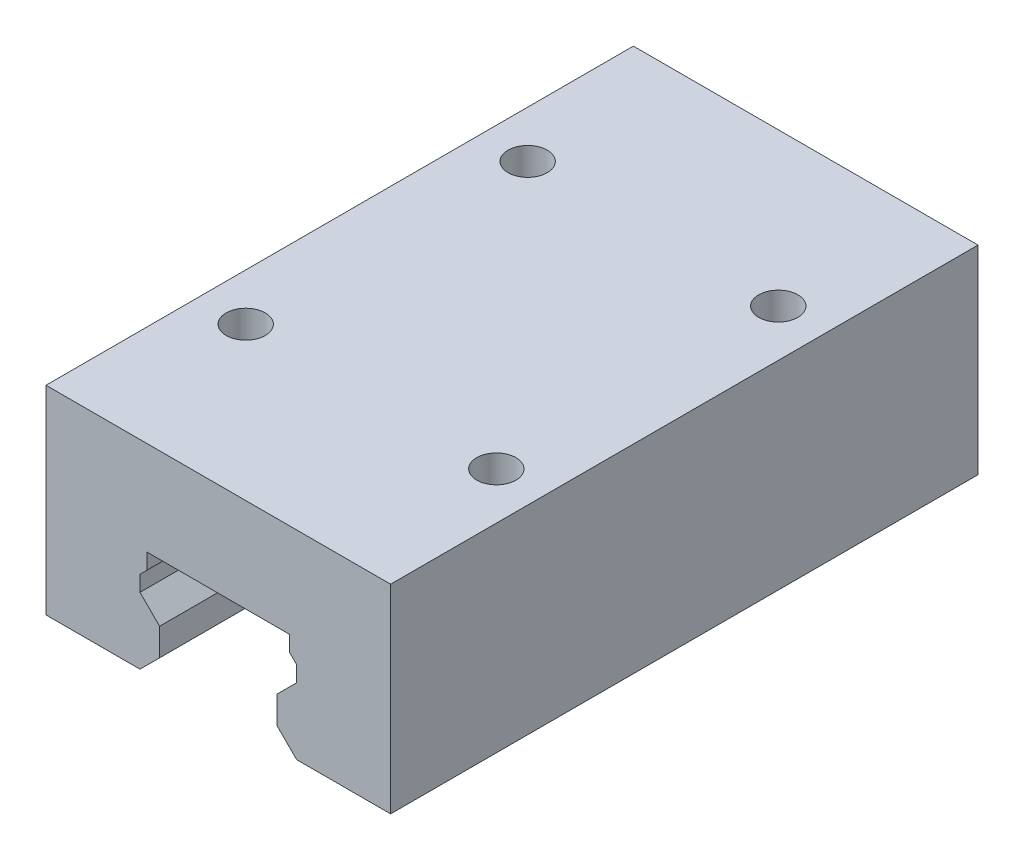
ISO-10303-21;
HEADER;
FILE_DESCRIPTION(('STEP AP214'),'2;1');
FILE_NAME('part.step','',(''),(''),'','','');
FILE_SCHEMA(('AUTOMOTIVE_DESIGN { 1 0 10303 214 1 1 1 1 }'));
ENDSEC;
DATA;
#1=APPLICATION_CONTEXT('core data for automotive mechanical design processes');
#2=APPLICATION_PROTOCOL_DEFINITION('international standard','automotive_design',2000,#1);
#3=PRODUCT_CONTEXT('',#1,'mechanical');
#4=PRODUCT('Part','Part','',(#3));
#5=PRODUCT_RELATED_PRODUCT_CATEGORY('part','',(#4));
#6=PRODUCT_DEFINITION_FORMATION('','',#4);
#7=PRODUCT_DEFINITION_CONTEXT('part definition',#1,'design');
#8=PRODUCT_DEFINITION('design','',#6,#7);
#9=PRODUCT_DEFINITION_SHAPE('','',#8);
#10=(LENGTH_UNIT() NAMED_UNIT(*) SI_UNIT(.MILLI.,.METRE.));
#11=(NAMED_UNIT(*) PLANE_ANGLE_UNIT() SI_UNIT($,.RADIAN.));
#12=(NAMED_UNIT(*) SI_UNIT($,.STERADIAN.) SOLID_ANGLE_UNIT());
#13=UNCERTAINTY_MEASURE_WITH_UNIT(LENGTH_MEASURE(1.E-05),#10,'distance_accuracy_value','');
#14=(GEOMETRIC_REPRESENTATION_CONTEXT(3) GLOBAL_UNCERTAINTY_ASSIGNED_CONTEXT((#13)) GLOBAL_UNIT_ASSIGNED_CONTEXT((#10,
#11,#12)) REPRESENTATION_CONTEXT('',''));
#15=CARTESIAN_POINT('',(0.,0.,0.));
#16=DIRECTION('',(0.,0.,1.));
#17=DIRECTION('',(1.,0.,0.));
#18=AXIS2_PLACEMENT_3D('',#15,#16,#17);
#19=CARTESIAN_POINT('',(22.,0.,-75.));
#20=DIRECTION('',(1.,0.,0.));
#21=DIRECTION('',(0.,1.,0.));
#22=AXIS2_PLACEMENT_3D('',#19,#20,#21);
#23=PLANE('',#22);
#24=DIRECTION('',(0.,1.,0.));
#25=VECTOR('',#24,1.);
#26=CARTESIAN_POINT('',(22.,0.,0.));
#27=LINE('',#26,#25);
#28=CARTESIAN_POINT('',(22.,-25.4,0.));
#29=VERTEX_POINT('',#28);
#30=CARTESIAN_POINT('',(22.,0.,0.));
#31=VERTEX_POINT('',#30);
#32=EDGE_CURVE('E208',#29,#31,#27,.T.);
#33=ORIENTED_EDGE('',*,*,#32,.F.);
#34=DIRECTION('',(0.,0.,1.));
#35=VECTOR('',#34,1.);
#36=CARTESIAN_POINT('',(22.,-25.4,-75.));
#37=LINE('',#36,#35);
#38=CARTESIAN_POINT('',(22.,-25.4,-75.));
#39=VERTEX_POINT('',#38);
#40=EDGE_CURVE('E11',#39,#29,#37,.T.);
#41=ORIENTED_EDGE('',*,*,#40,.F.);
#42=DIRECTION('',(0.,1.,0.));
#43=VECTOR('',#42,1.);
#44=CARTESIAN_POINT('',(22.,0.,-75.));
#45=LINE('',#44,#43);
#46=CARTESIAN_POINT('',(22.,0.,-75.));
#47=VERTEX_POINT('',#46);
#48=EDGE_CURVE('E277',#39,#47,#45,.T.);
#49=ORIENTED_EDGE('',*,*,#48,.T.);
#50=DIRECTION('',(0.,0.,1.));
#51=VECTOR('',#50,1.);
#52=CARTESIAN_POINT('',(22.,0.,-75.));
#53=LINE('',#52,#51);
#54=EDGE_CURVE('E48',#47,#31,#53,.T.);
#55=ORIENTED_EDGE('',*,*,#54,.T.);
#56=EDGE_LOOP('',(#33,#41,#49,#55));
#57=FACE_BOUND('',#56,.T.);
#58=ADVANCED_FACE('F45',(#57),#23,.T.);
#59=CARTESIAN_POINT('',(22.,-25.4,-75.));
#60=DIRECTION('',(0.,-1.,0.));
#61=DIRECTION('',(0.,0.,-1.));
#62=AXIS2_PLACEMENT_3D('',#59,#60,#61);
#63=PLANE('',#62);
#64=DIRECTION('',(1.,0.,0.));
#65=VECTOR('',#64,1.);
#66=CARTESIAN_POINT('',(22.,-25.4,0.));
#67=LINE('',#66,#65);
#68=CARTESIAN_POINT('',(10.,-25.4,0.));
#69=VERTEX_POINT('',#68);
#70=EDGE_CURVE('E274',#69,#29,#67,.T.);
#71=ORIENTED_EDGE('',*,*,#70,.F.);
#72=DIRECTION('',(0.,0.,1.));
#73=VECTOR('',#72,1.);
#74=CARTESIAN_POINT('',(10.,-25.4,-75.));
#75=LINE('',#74,#73);
#76=CARTESIAN_POINT('',(10.,-25.4,-75.));
#77=VERTEX_POINT('',#76);
#78=EDGE_CURVE('E55',#77,#69,#75,.T.);
#79=ORIENTED_EDGE('',*,*,#78,.F.);
#80=DIRECTION('',(1.,0.,0.));
#81=VECTOR('',#80,1.);
#82=CARTESIAN_POINT('',(22.,-25.4,-75.));
#83=LINE('',#82,#81);
#84=EDGE_CURVE('E194',#77,#39,#83,.T.);
#85=ORIENTED_EDGE('',*,*,#84,.T.);
#86=ORIENTED_EDGE('',*,*,#40,.T.);
#87=EDGE_LOOP('',(#71,#79,#85,#86));
#88=FACE_BOUND('',#87,.T.);
#89=ADVANCED_FACE('F325',(#88),#63,.T.);
#90=CARTESIAN_POINT('',(10.,-25.4,-75.));
#91=DIRECTION('',(-0.707106781186549,-0.707106781186546,0.));
#92=DIRECTION('',(0.707106781186546,-0.707106781186549,0.));
#93=AXIS2_PLACEMENT_3D('',#90,#91,#92);
#94=PLANE('',#93);
#95=DIRECTION('',(0.707106781186546,-0.707106781186549,0.));
#96=VECTOR('',#95,1.);
#97=CARTESIAN_POINT('',(10.,-25.4,0.));
#98=LINE('',#97,#96);
#99=CARTESIAN_POINT('',(7.50000000000001,-22.9,0.));
#100=VERTEX_POINT('',#99);
#101=EDGE_CURVE('E180',#100,#69,#98,.T.);
#102=ORIENTED_EDGE('',*,*,#101,.F.);
#103=DIRECTION('',(0.,0.,1.));
#104=VECTOR('',#103,1.);
#105=CARTESIAN_POINT('',(7.50000000000001,-22.9,-75.));
#106=LINE('',#105,#104);
#107=CARTESIAN_POINT('',(7.50000000000001,-22.9,-75.));
#108=VERTEX_POINT('',#107);
#109=EDGE_CURVE('E175',#108,#100,#106,.T.);
#110=ORIENTED_EDGE('',*,*,#109,.F.);
#111=DIRECTION('',(0.707106781186546,-0.707106781186549,0.));
#112=VECTOR('',#111,1.);
#113=CARTESIAN_POINT('',(10.,-25.4,-75.));
#114=LINE('',#113,#112);
#115=EDGE_CURVE('E178',#108,#77,#114,.T.);
#116=ORIENTED_EDGE('',*,*,#115,.T.);
#117=ORIENTED_EDGE('',*,*,#78,.T.);
#118=EDGE_LOOP('',(#102,#110,#116,#117));
#119=FACE_BOUND('',#118,.T.);
#120=ADVANCED_FACE('F177',(#119),#94,.T.);
#121=CARTESIAN_POINT('',(7.50000000000001,-22.9,-75.));
#122=DIRECTION('',(-1.,0.,0.));
#123=DIRECTION('',(0.,-1.,0.));
#124=AXIS2_PLACEMENT_3D('',#121,#122,#123);
#125=PLANE('',#124);
#126=DIRECTION('',(0.,-1.,0.));
#127=VECTOR('',#126,1.);
#128=CARTESIAN_POINT('',(7.50000000000001,-22.9,0.));
#129=LINE('',#128,#127);
#130=CARTESIAN_POINT('',(7.5,-19.4,0.));
#131=VERTEX_POINT('',#130);
#132=EDGE_CURVE('E269',#131,#100,#129,.T.);
#133=ORIENTED_EDGE('',*,*,#132,.F.);
#134=DIRECTION('',(0.,0.,1.));
#135=VECTOR('',#134,1.);
#136=CARTESIAN_POINT('',(7.5,-19.4,-75.));
#137=LINE('',#136,#135);
#138=CARTESIAN_POINT('',(7.5,-19.4,-75.));
#139=VERTEX_POINT('',#138);
#140=EDGE_CURVE('E186',#139,#131,#137,.T.);
#141=ORIENTED_EDGE('',*,*,#140,.F.);
#142=DIRECTION('',(0.,-1.,0.));
#143=VECTOR('',#142,1.);
#144=CARTESIAN_POINT('',(7.50000000000001,-22.9,-75.));
#145=LINE('',#144,#143);
#146=EDGE_CURVE('E192',#139,#108,#145,.T.);
#147=ORIENTED_EDGE('',*,*,#146,.T.);
#148=ORIENTED_EDGE('',*,*,#109,.T.);
#149=EDGE_LOOP('',(#133,#141,#147,#148));
#150=FACE_BOUND('',#149,.T.);
#151=ADVANCED_FACE('F197',(#150),#125,.T.);
#152=CARTESIAN_POINT('',(7.5,-19.4,-75.));
#153=DIRECTION('',(-0.707106781186547,0.707106781186548,0.));
#154=DIRECTION('',(-0.707106781186548,-0.707106781186547,0.));
#155=AXIS2_PLACEMENT_3D('',#152,#153,#154);
#156=PLANE('',#155);
#157=DIRECTION('',(-0.707106781186548,-0.707106781186547,0.));
#158=VECTOR('',#157,1.);
#159=CARTESIAN_POINT('',(7.5,-19.4,0.));
#160=LINE('',#159,#158);
#161=CARTESIAN_POINT('',(10.,-16.9,0.));
#162=VERTEX_POINT('',#161);
#163=EDGE_CURVE('E265',#162,#131,#160,.T.);
#164=ORIENTED_EDGE('',*,*,#163,.F.);
#165=DIRECTION('',(0.,0.,1.));
#166=VECTOR('',#165,1.);
#167=CARTESIAN_POINT('',(10.,-16.9,-75.));
#168=LINE('',#167,#166);
#169=CARTESIAN_POINT('',(10.,-16.9,-75.));
#170=VERTEX_POINT('',#169);
#171=EDGE_CURVE('E283',#170,#162,#168,.T.);
#172=ORIENTED_EDGE('',*,*,#171,.F.);
#173=DIRECTION('',(-0.707106781186548,-0.707106781186547,0.));
#174=VECTOR('',#173,1.);
#175=CARTESIAN_POINT('',(7.5,-19.4,-75.));
#176=LINE('',#175,#174);
#177=EDGE_CURVE('E199',#170,#139,#176,.T.);
#178=ORIENTED_EDGE('',*,*,#177,.T.);
#179=ORIENTED_EDGE('',*,*,#140,.T.);
#180=EDGE_LOOP('',(#164,#172,#178,#179));
#181=FACE_BOUND('',#180,.T.);
#182=ADVANCED_FACE('F338',(#181),#156,.T.);
#183=CARTESIAN_POINT('',(10.,-16.9,-75.));
#184=DIRECTION('',(-1.,0.,0.));
#185=DIRECTION('',(0.,0.,1.));
#186=AXIS2_PLACEMENT_3D('',#183,#184,#185);
#187=PLANE('',#186);
#188=DIRECTION('',(0.,-1.,0.));
#189=VECTOR('',#188,1.);
#190=CARTESIAN_POINT('',(10.,-16.9,0.));
#191=LINE('',#190,#189);
#192=CARTESIAN_POINT('',(10.,-14.9,0.));
#193=VERTEX_POINT('',#192);
#194=EDGE_CURVE('E261',#193,#162,#191,.T.);
#195=ORIENTED_EDGE('',*,*,#194,.F.);
#196=DIRECTION('',(0.,0.,1.));
#197=VECTOR('',#196,1.);
#198=CARTESIAN_POINT('',(10.,-14.9,-75.));
#199=LINE('',#198,#197);
#200=CARTESIAN_POINT('',(10.,-14.9,-75.));
#201=VERTEX_POINT('',#200);
#202=EDGE_CURVE('E286',#201,#193,#199,.T.);
#203=ORIENTED_EDGE('',*,*,#202,.F.);
#204=DIRECTION('',(0.,-1.,0.));
#205=VECTOR('',#204,1.);
#206=CARTESIAN_POINT('',(10.,-16.9,-75.));
#207=LINE('',#206,#205);
#208=EDGE_CURVE('E202',#201,#170,#207,.T.);
#209=ORIENTED_EDGE('',*,*,#208,.T.);
#210=ORIENTED_EDGE('',*,*,#171,.T.);
#211=EDGE_LOOP('',(#195,#203,#209,#210));
#212=FACE_BOUND('',#211,.T.);
#213=ADVANCED_FACE('F341',(#212),#187,.T.);
#214=CARTESIAN_POINT('',(10.,-14.9,-75.));
#215=DIRECTION('',(-0.707106781186548,-0.707106781186548,0.));
#216=DIRECTION('',(0.707106781186548,-0.707106781186548,0.));
#217=AXIS2_PLACEMENT_3D('',#214,#215,#216);
#218=PLANE('',#217);
#219=DIRECTION('',(0.707106781186547,-0.707106781186547,0.));
#220=VECTOR('',#219,1.);
#221=CARTESIAN_POINT('',(10.,-14.9,0.));
#222=LINE('',#221,#220);
#223=CARTESIAN_POINT('',(9.10000000000001,-14.,0.));
#224=VERTEX_POINT('',#223);
#225=EDGE_CURVE('E257',#224,#193,#222,.T.);
#226=ORIENTED_EDGE('',*,*,#225,.F.);
#227=DIRECTION('',(0.,0.,1.));
#228=VECTOR('',#227,1.);
#229=CARTESIAN_POINT('',(9.10000000000001,-14.,-75.));
#230=LINE('',#229,#228);
#231=CARTESIAN_POINT('',(9.10000000000001,-14.,-75.));
#232=VERTEX_POINT('',#231);
#233=EDGE_CURVE('E289',#232,#224,#230,.T.);
#234=ORIENTED_EDGE('',*,*,#233,.F.);
#235=DIRECTION('',(0.707106781186547,-0.707106781186547,0.));
#236=VECTOR('',#235,1.);
#237=CARTESIAN_POINT('',(10.,-14.9,-75.));
#238=LINE('',#237,#236);
#239=EDGE_CURVE('E467',#232,#201,#238,.T.);
#240=ORIENTED_EDGE('',*,*,#239,.T.);
#241=ORIENTED_EDGE('',*,*,#202,.T.);
#242=EDGE_LOOP('',(#226,#234,#240,#241));
#243=FACE_BOUND('',#242,.T.);
#244=ADVANCED_FACE('F345',(#243),#218,.T.);
#245=CARTESIAN_POINT('',(9.10000000000001,-14.,-75.));
#246=DIRECTION('',(-1.,0.,0.));
#247=DIRECTION('',(0.,0.,1.));
#248=AXIS2_PLACEMENT_3D('',#245,#246,#247);
#249=PLANE('',#248);
#250=DIRECTION('',(0.,-1.,0.));
#251=VECTOR('',#250,1.);
#252=CARTESIAN_POINT('',(9.10000000000001,-14.,0.));
#253=LINE('',#252,#251);
#254=CARTESIAN_POINT('',(9.10000000000001,-12.,0.));
#255=VERTEX_POINT('',#254);
#256=EDGE_CURVE('E253',#255,#224,#253,.T.);
#257=ORIENTED_EDGE('',*,*,#256,.F.);
#258=DIRECTION('',(0.,0.,1.));
#259=VECTOR('',#258,1.);
#260=CARTESIAN_POINT('',(9.10000000000001,-12.,-75.));
#261=LINE('',#260,#259);
#262=CARTESIAN_POINT('',(9.10000000000001,-12.,-75.));
#263=VERTEX_POINT('',#262);
#264=EDGE_CURVE('E292',#263,#255,#261,.T.);
#265=ORIENTED_EDGE('',*,*,#264,.F.);
#266=DIRECTION('',(0.,-1.,0.));
#267=VECTOR('',#266,1.);
#268=CARTESIAN_POINT('',(9.10000000000001,-14.,-75.));
#269=LINE('',#268,#267);
#270=EDGE_CURVE('E463',#263,#232,#269,.T.);
#271=ORIENTED_EDGE('',*,*,#270,.T.);
#272=ORIENTED_EDGE('',*,*,#233,.T.);
#273=EDGE_LOOP('',(#257,#265,#271,#272));
#274=FACE_BOUND('',#273,.T.);
#275=ADVANCED_FACE('F349',(#274),#249,.T.);
#276=CARTESIAN_POINT('',(9.10000000000001,-12.,-75.));
#277=DIRECTION('',(0.,-1.,0.));
#278=DIRECTION('',(0.,0.,-1.));
#279=AXIS2_PLACEMENT_3D('',#276,#277,#278);
#280=PLANE('',#279);
#281=DIRECTION('',(1.,0.,0.));
#282=VECTOR('',#281,1.);
#283=CARTESIAN_POINT('',(9.10000000000001,-12.,0.));
#284=LINE('',#283,#282);
#285=CARTESIAN_POINT('',(-9.10000000000001,-12.,0.));
#286=VERTEX_POINT('',#285);
#287=EDGE_CURVE('E249',#286,#255,#284,.T.);
#288=ORIENTED_EDGE('',*,*,#287,.F.);
#289=DIRECTION('',(0.,0.,1.));
#290=VECTOR('',#289,1.);
#291=CARTESIAN_POINT('',(-9.10000000000001,-12.,-75.));
#292=LINE('',#291,#290);
#293=CARTESIAN_POINT('',(-9.10000000000001,-12.,-75.));
#294=VERTEX_POINT('',#293);
#295=EDGE_CURVE('E295',#294,#286,#292,.T.);
#296=ORIENTED_EDGE('',*,*,#295,.F.);
#297=DIRECTION('',(1.,0.,0.));
#298=VECTOR('',#297,1.);
#299=CARTESIAN_POINT('',(9.10000000000001,-12.,-75.));
#300=LINE('',#299,#298);
#301=EDGE_CURVE('E459',#294,#263,#300,.T.);
#302=ORIENTED_EDGE('',*,*,#301,.T.);
#303=ORIENTED_EDGE('',*,*,#264,.T.);
#304=EDGE_LOOP('',(#288,#296,#302,#303));
#305=FACE_BOUND('',#304,.T.);
#306=ADVANCED_FACE('F353',(#305),#280,.T.);
#307=CARTESIAN_POINT('',(-9.10000000000001,-14.,-75.));
#308=DIRECTION('',(1.,0.,0.));
#309=DIRECTION('',(0.,0.,-1.));
#310=AXIS2_PLACEMENT_3D('',#307,#308,#309);
#311=PLANE('',#310);
#312=DIRECTION('',(0.,1.,0.));
#313=VECTOR('',#312,1.);
#314=CARTESIAN_POINT('',(-9.10000000000001,-14.,0.));
#315=LINE('',#314,#313);
#316=CARTESIAN_POINT('',(-9.10000000000001,-14.,0.));
#317=VERTEX_POINT('',#316);
#318=EDGE_CURVE('E245',#317,#286,#315,.T.);
#319=ORIENTED_EDGE('',*,*,#318,.F.);
#320=DIRECTION('',(0.,0.,1.));
#321=VECTOR('',#320,1.);
#322=CARTESIAN_POINT('',(-9.10000000000001,-14.,-75.));
#323=LINE('',#322,#321);
#324=CARTESIAN_POINT('',(-9.10000000000001,-14.,-75.));
#325=VERTEX_POINT('',#324);
#326=EDGE_CURVE('E298',#325,#317,#323,.T.);
#327=ORIENTED_EDGE('',*,*,#326,.F.);
#328=DIRECTION('',(0.,1.,0.));
#329=VECTOR('',#328,1.);
#330=CARTESIAN_POINT('',(-9.10000000000001,-14.,-75.));
#331=LINE('',#330,#329);
#332=EDGE_CURVE('E455',#325,#294,#331,.T.);
#333=ORIENTED_EDGE('',*,*,#332,.T.);
#334=ORIENTED_EDGE('',*,*,#295,.T.);
#335=EDGE_LOOP('',(#319,#327,#333,#334));
#336=FACE_BOUND('',#335,.T.);
#337=ADVANCED_FACE('F357',(#336),#311,.T.);
#338=CARTESIAN_POINT('',(-10.,-14.9,-75.));
#339=DIRECTION('',(0.707106781186548,-0.707106781186548,0.));
#340=DIRECTION('',(0.707106781186548,0.707106781186548,0.));
#341=AXIS2_PLACEMENT_3D('',#338,#339,#340);
#342=PLANE('',#341);
#343=DIRECTION('',(0.707106781186547,0.707106781186547,0.));
#344=VECTOR('',#343,1.);
#345=CARTESIAN_POINT('',(-10.,-14.9,0.));
#346=LINE('',#345,#344);
#347=CARTESIAN_POINT('',(-10.,-14.9,0.));
#348=VERTEX_POINT('',#347);
#349=EDGE_CURVE('E241',#348,#317,#346,.T.);
#350=ORIENTED_EDGE('',*,*,#349,.F.);
#351=DIRECTION('',(0.,0.,1.));
#352=VECTOR('',#351,1.);
#353=CARTESIAN_POINT('',(-10.,-14.9,-75.));
#354=LINE('',#353,#352);
#355=CARTESIAN_POINT('',(-10.,-14.9,-75.));
#356=VERTEX_POINT('',#355);
#357=EDGE_CURVE('E301',#356,#348,#354,.T.);
#358=ORIENTED_EDGE('',*,*,#357,.F.);
#359=DIRECTION('',(0.707106781186547,0.707106781186547,0.));
#360=VECTOR('',#359,1.);
#361=CARTESIAN_POINT('',(-10.,-14.9,-75.));
#362=LINE('',#361,#360);
#363=EDGE_CURVE('E451',#356,#325,#362,.T.);
#364=ORIENTED_EDGE('',*,*,#363,.T.);
#365=ORIENTED_EDGE('',*,*,#326,.T.);
#366=EDGE_LOOP('',(#350,#358,#364,#365));
#367=FACE_BOUND('',#366,.T.);
#368=ADVANCED_FACE('F361',(#367),#342,.T.);
#369=CARTESIAN_POINT('',(-10.,-16.9,-75.));
#370=DIRECTION('',(1.,0.,0.));
#371=DIRECTION('',(0.,0.,-1.));
#372=AXIS2_PLACEMENT_3D('',#369,#370,#371);
#373=PLANE('',#372);
#374=DIRECTION('',(0.,1.,0.));
#375=VECTOR('',#374,1.);
#376=CARTESIAN_POINT('',(-10.,-16.9,0.));
#377=LINE('',#376,#375);
#378=CARTESIAN_POINT('',(-10.,-16.9,0.));
#379=VERTEX_POINT('',#378);
#380=EDGE_CURVE('E237',#379,#348,#377,.T.);
#381=ORIENTED_EDGE('',*,*,#380,.F.);
#382=DIRECTION('',(0.,0.,1.));
#383=VECTOR('',#382,1.);
#384=CARTESIAN_POINT('',(-10.,-16.9,-75.));
#385=LINE('',#384,#383);
#386=CARTESIAN_POINT('',(-10.,-16.9,-75.));
#387=VERTEX_POINT('',#386);
#388=EDGE_CURVE('E304',#387,#379,#385,.T.);
#389=ORIENTED_EDGE('',*,*,#388,.F.);
#390=DIRECTION('',(0.,1.,0.));
#391=VECTOR('',#390,1.);
#392=CARTESIAN_POINT('',(-10.,-16.9,-75.));
#393=LINE('',#392,#391);
#394=EDGE_CURVE('E447',#387,#356,#393,.T.);
#395=ORIENTED_EDGE('',*,*,#394,.T.);
#396=ORIENTED_EDGE('',*,*,#357,.T.);
#397=EDGE_LOOP('',(#381,#389,#395,#396));
#398=FACE_BOUND('',#397,.T.);
#399=ADVANCED_FACE('F365',(#398),#373,.T.);
#400=CARTESIAN_POINT('',(-7.5,-19.4,-75.));
#401=DIRECTION('',(0.707106781186547,0.707106781186548,0.));
#402=DIRECTION('',(-0.707106781186548,0.707106781186547,0.));
#403=AXIS2_PLACEMENT_3D('',#400,#401,#402);
#404=PLANE('',#403);
#405=DIRECTION('',(-0.707106781186548,0.707106781186547,0.));
#406=VECTOR('',#405,1.);
#407=CARTESIAN_POINT('',(-7.5,-19.4,0.));
#408=LINE('',#407,#406);
#409=CARTESIAN_POINT('',(-7.5,-19.4,0.));
#410=VERTEX_POINT('',#409);
#411=EDGE_CURVE('E233',#410,#379,#408,.T.);
#412=ORIENTED_EDGE('',*,*,#411,.F.);
#413=DIRECTION('',(0.,0.,1.));
#414=VECTOR('',#413,1.);
#415=CARTESIAN_POINT('',(-7.5,-19.4,-75.));
#416=LINE('',#415,#414);
#417=CARTESIAN_POINT('',(-7.5,-19.4,-75.));
#418=VERTEX_POINT('',#417);
#419=EDGE_CURVE('E307',#418,#410,#416,.T.);
#420=ORIENTED_EDGE('',*,*,#419,.F.);
#421=DIRECTION('',(-0.707106781186548,0.707106781186547,0.));
#422=VECTOR('',#421,1.);
#423=CARTESIAN_POINT('',(-7.5,-19.4,-75.));
#424=LINE('',#423,#422);
#425=EDGE_CURVE('E443',#418,#387,#424,.T.);
#426=ORIENTED_EDGE('',*,*,#425,.T.);
#427=ORIENTED_EDGE('',*,*,#388,.T.);
#428=EDGE_LOOP('',(#412,#420,#426,#427));
#429=FACE_BOUND('',#428,.T.);
#430=ADVANCED_FACE('F369',(#429),#404,.T.);
#431=CARTESIAN_POINT('',(-7.50000000000001,-22.9,-75.));
#432=DIRECTION('',(1.,0.,0.));
#433=DIRECTION('',(0.,1.,0.));
#434=AXIS2_PLACEMENT_3D('',#431,#432,#433);
#435=PLANE('',#434);
#436=DIRECTION('',(0.,1.,0.));
#437=VECTOR('',#436,1.);
#438=CARTESIAN_POINT('',(-7.50000000000001,-22.9,0.));
#439=LINE('',#438,#437);
#440=CARTESIAN_POINT('',(-7.50000000000001,-22.9,0.));
#441=VERTEX_POINT('',#440);
#442=EDGE_CURVE('E229',#441,#410,#439,.T.);
#443=ORIENTED_EDGE('',*,*,#442,.F.);
#444=DIRECTION('',(0.,0.,1.));
#445=VECTOR('',#444,1.);
#446=CARTESIAN_POINT('',(-7.50000000000001,-22.9,-75.));
#447=LINE('',#446,#445);
#448=CARTESIAN_POINT('',(-7.50000000000001,-22.9,-75.));
#449=VERTEX_POINT('',#448);
#450=EDGE_CURVE('E310',#449,#441,#447,.T.);
#451=ORIENTED_EDGE('',*,*,#450,.F.);
#452=DIRECTION('',(0.,1.,0.));
#453=VECTOR('',#452,1.);
#454=CARTESIAN_POINT('',(-7.50000000000001,-22.9,-75.));
#455=LINE('',#454,#453);
#456=EDGE_CURVE('E439',#449,#418,#455,.T.);
#457=ORIENTED_EDGE('',*,*,#456,.T.);
#458=ORIENTED_EDGE('',*,*,#419,.T.);
#459=EDGE_LOOP('',(#443,#451,#457,#458));
#460=FACE_BOUND('',#459,.T.);
#461=ADVANCED_FACE('F373',(#460),#435,.T.);
#462=CARTESIAN_POINT('',(-10.,-25.4,-75.));
#463=DIRECTION('',(0.707106781186549,-0.707106781186546,0.));
#464=DIRECTION('',(0.707106781186546,0.707106781186549,0.));
#465=AXIS2_PLACEMENT_3D('',#462,#463,#464);
#466=PLANE('',#465);
#467=DIRECTION('',(0.707106781186546,0.707106781186549,0.));
#468=VECTOR('',#467,1.);
#469=CARTESIAN_POINT('',(-10.,-25.4,0.));
#470=LINE('',#469,#468);
#471=CARTESIAN_POINT('',(-10.,-25.4,0.));
#472=VERTEX_POINT('',#471);
#473=EDGE_CURVE('E225',#472,#441,#470,.T.);
#474=ORIENTED_EDGE('',*,*,#473,.F.);
#475=DIRECTION('',(0.,0.,1.));
#476=VECTOR('',#475,1.);
#477=CARTESIAN_POINT('',(-10.,-25.4,-75.));
#478=LINE('',#477,#476);
#479=CARTESIAN_POINT('',(-10.,-25.4,-75.));
#480=VERTEX_POINT('',#479);
#481=EDGE_CURVE('E313',#480,#472,#478,.T.);
#482=ORIENTED_EDGE('',*,*,#481,.F.);
#483=DIRECTION('',(0.707106781186546,0.707106781186549,0.));
#484=VECTOR('',#483,1.);
#485=CARTESIAN_POINT('',(-10.,-25.4,-75.));
#486=LINE('',#485,#484);
#487=EDGE_CURVE('E435',#480,#449,#486,.T.);
#488=ORIENTED_EDGE('',*,*,#487,.T.);
#489=ORIENTED_EDGE('',*,*,#450,.T.);
#490=EDGE_LOOP('',(#474,#482,#488,#489));
#491=FACE_BOUND('',#490,.T.);
#492=ADVANCED_FACE('F377',(#491),#466,.T.);
#493=CARTESIAN_POINT('',(-22.,-25.4,-75.));
#494=DIRECTION('',(0.,-1.,0.));
#495=DIRECTION('',(0.,0.,-1.));
#496=AXIS2_PLACEMENT_3D('',#493,#494,#495);
#497=PLANE('',#496);
#498=DIRECTION('',(1.,0.,0.));
#499=VECTOR('',#498,1.);
#500=CARTESIAN_POINT('',(-22.,-25.4,0.));
#501=LINE('',#500,#499);
#502=CARTESIAN_POINT('',(-22.,-25.4,0.));
#503=VERTEX_POINT('',#502);
#504=EDGE_CURVE('E221',#503,#472,#501,.T.);
#505=ORIENTED_EDGE('',*,*,#504,.F.);
#506=DIRECTION('',(0.,0.,1.));
#507=VECTOR('',#506,1.);
#508=CARTESIAN_POINT('',(-22.,-25.4,-75.));
#509=LINE('',#508,#507);
#510=CARTESIAN_POINT('',(-22.,-25.4,-75.));
#511=VERTEX_POINT('',#510);
#512=EDGE_CURVE('E316',#511,#503,#509,.T.);
#513=ORIENTED_EDGE('',*,*,#512,.F.);
#514=DIRECTION('',(1.,0.,0.));
#515=VECTOR('',#514,1.);
#516=CARTESIAN_POINT('',(-22.,-25.4,-75.));
#517=LINE('',#516,#515);
#518=EDGE_CURVE('E431',#511,#480,#517,.T.);
#519=ORIENTED_EDGE('',*,*,#518,.T.);
#520=ORIENTED_EDGE('',*,*,#481,.T.);
#521=EDGE_LOOP('',(#505,#513,#519,#520));
#522=FACE_BOUND('',#521,.T.);
#523=ADVANCED_FACE('F381',(#522),#497,.T.);
#524=CARTESIAN_POINT('',(-22.,0.,-75.));
#525=DIRECTION('',(-1.,0.,0.));
#526=DIRECTION('',(0.,-1.,0.));
#527=AXIS2_PLACEMENT_3D('',#524,#525,#526);
#528=PLANE('',#527);
#529=DIRECTION('',(0.,-1.,0.));
#530=VECTOR('',#529,1.);
#531=CARTESIAN_POINT('',(-22.,0.,0.));
#532=LINE('',#531,#530);
#533=CARTESIAN_POINT('',(-22.,0.,0.));
#534=VERTEX_POINT('',#533);
#535=EDGE_CURVE('E217',#534,#503,#532,.T.);
#536=ORIENTED_EDGE('',*,*,#535,.F.);
#537=DIRECTION('',(0.,0.,1.));
#538=VECTOR('',#537,1.);
#539=CARTESIAN_POINT('',(-22.,0.,-75.));
#540=LINE('',#539,#538);
#541=CARTESIAN_POINT('',(-22.,0.,-75.));
#542=VERTEX_POINT('',#541);
#543=EDGE_CURVE('E318',#542,#534,#540,.T.);
#544=ORIENTED_EDGE('',*,*,#543,.F.);
#545=DIRECTION('',(0.,-1.,0.));
#546=VECTOR('',#545,1.);
#547=CARTESIAN_POINT('',(-22.,0.,-75.));
#548=LINE('',#547,#546);
#549=EDGE_CURVE('E427',#542,#511,#548,.T.);
#550=ORIENTED_EDGE('',*,*,#549,.T.);
#551=ORIENTED_EDGE('',*,*,#512,.T.);
#552=EDGE_LOOP('',(#536,#544,#550,#551));
#553=FACE_BOUND('',#552,.T.);
#554=ADVANCED_FACE('F385',(#553),#528,.T.);
#555=CARTESIAN_POINT('',(-22.,0.,-75.));
#556=DIRECTION('',(0.,1.,0.));
#557=DIRECTION('',(0.,0.,1.));
#558=AXIS2_PLACEMENT_3D('',#555,#556,#557);
#559=PLANE('',#558);
#560=CARTESIAN_POINT('',(16.,0.,-55.5));
#561=DIRECTION('',(0.,1.,0.));
#562=DIRECTION('',(0.,0.,1.));
#563=AXIS2_PLACEMENT_3D('',#560,#561,#562);
#564=CIRCLE('',#563,2.5);
#565=CARTESIAN_POINT('',(16.,0.,-53.));
#566=VERTEX_POINT('',#565);
#567=EDGE_CURVE('E399',#566,#566,#564,.T.);
#568=ORIENTED_EDGE('',*,*,#567,.F.);
#569=EDGE_LOOP('',(#568));
#570=FACE_BOUND('',#569,.T.);
#571=CARTESIAN_POINT('',(16.,0.,-19.5));
#572=DIRECTION('',(0.,1.,0.));
#573=DIRECTION('',(0.,0.,1.));
#574=AXIS2_PLACEMENT_3D('',#571,#572,#573);
#575=CIRCLE('',#574,2.5);
#576=CARTESIAN_POINT('',(16.,0.,-17.));
#577=VERTEX_POINT('',#576);
#578=EDGE_CURVE('E403',#577,#577,#575,.T.);
#579=ORIENTED_EDGE('',*,*,#578,.F.);
#580=EDGE_LOOP('',(#579));
#581=FACE_BOUND('',#580,.T.);
#582=CARTESIAN_POINT('',(-16.,0.,-19.5));
#583=DIRECTION('',(0.,1.,0.));
#584=DIRECTION('',(0.,0.,1.));
#585=AXIS2_PLACEMENT_3D('',#582,#583,#584);
#586=CIRCLE('',#585,2.5);
#587=CARTESIAN_POINT('',(-16.,0.,-17.));
#588=VERTEX_POINT('',#587);
#589=EDGE_CURVE('E407',#588,#588,#586,.T.);
#590=ORIENTED_EDGE('',*,*,#589,.F.);
#591=EDGE_LOOP('',(#590));
#592=FACE_BOUND('',#591,.T.);
#593=CARTESIAN_POINT('',(-16.,0.,-55.5));
#594=DIRECTION('',(0.,1.,0.));
#595=DIRECTION('',(0.,0.,1.));
#596=AXIS2_PLACEMENT_3D('',#593,#594,#595);
#597=CIRCLE('',#596,2.5);
#598=CARTESIAN_POINT('',(-16.,0.,-53.));
#599=VERTEX_POINT('',#598);
#600=EDGE_CURVE('E410',#599,#599,#597,.T.);
#601=ORIENTED_EDGE('',*,*,#600,.F.);
#602=EDGE_LOOP('',(#601));
#603=FACE_BOUND('',#602,.T.);
#604=DIRECTION('',(-1.,0.,0.));
#605=VECTOR('',#604,1.);
#606=CARTESIAN_POINT('',(-22.,0.,0.));
#607=LINE('',#606,#605);
#608=EDGE_CURVE('E212',#31,#534,#607,.T.);
#609=ORIENTED_EDGE('',*,*,#608,.F.);
#610=ORIENTED_EDGE('',*,*,#54,.F.);
#611=DIRECTION('',(-1.,0.,0.));
#612=VECTOR('',#611,1.);
#613=CARTESIAN_POINT('',(-22.,0.,-75.));
#614=LINE('',#613,#612);
#615=EDGE_CURVE('E424',#47,#542,#614,.T.);
#616=ORIENTED_EDGE('',*,*,#615,.T.);
#617=ORIENTED_EDGE('',*,*,#543,.T.);
#618=EDGE_LOOP('',(#609,#610,#616,#617));
#619=FACE_BOUND('',#618,.T.);
#620=ADVANCED_FACE('F322',(#570,#581,#592,#603,#619),#559,.T.);
#621=CARTESIAN_POINT('',(0.,0.,-75.));
#622=DIRECTION('',(0.,0.,-1.));
#623=DIRECTION('',(-1.,0.,0.));
#624=AXIS2_PLACEMENT_3D('',#621,#622,#623);
#625=PLANE('',#624);
#626=ORIENTED_EDGE('',*,*,#48,.F.);
#627=ORIENTED_EDGE('',*,*,#84,.F.);
#628=ORIENTED_EDGE('',*,*,#115,.F.);
#629=ORIENTED_EDGE('',*,*,#146,.F.);
#630=ORIENTED_EDGE('',*,*,#177,.F.);
#631=ORIENTED_EDGE('',*,*,#208,.F.);
#632=ORIENTED_EDGE('',*,*,#239,.F.);
#633=ORIENTED_EDGE('',*,*,#270,.F.);
#634=ORIENTED_EDGE('',*,*,#301,.F.);
#635=ORIENTED_EDGE('',*,*,#332,.F.);
#636=ORIENTED_EDGE('',*,*,#363,.F.);
#637=ORIENTED_EDGE('',*,*,#394,.F.);
#638=ORIENTED_EDGE('',*,*,#425,.F.);
#639=ORIENTED_EDGE('',*,*,#456,.F.);
#640=ORIENTED_EDGE('',*,*,#487,.F.);
#641=ORIENTED_EDGE('',*,*,#518,.F.);
#642=ORIENTED_EDGE('',*,*,#549,.F.);
#643=ORIENTED_EDGE('',*,*,#615,.F.);
#644=EDGE_LOOP('',(#626,#627,#628,#629,#630,#631,#632,#633,#634,#635,#636,#637,#638,#639,#640,
#641,#642,#643));
#645=FACE_BOUND('',#644,.T.);
#646=ADVANCED_FACE('F190',(#645),#625,.T.);
#647=CARTESIAN_POINT('',(0.,0.,0.));
#648=DIRECTION('',(0.,0.,-1.));
#649=DIRECTION('',(-1.,0.,0.));
#650=AXIS2_PLACEMENT_3D('',#647,#648,#649);
#651=PLANE('',#650);
#652=ORIENTED_EDGE('',*,*,#32,.T.);
#653=ORIENTED_EDGE('',*,*,#608,.T.);
#654=ORIENTED_EDGE('',*,*,#535,.T.);
#655=ORIENTED_EDGE('',*,*,#504,.T.);
#656=ORIENTED_EDGE('',*,*,#473,.T.);
#657=ORIENTED_EDGE('',*,*,#442,.T.);
#658=ORIENTED_EDGE('',*,*,#411,.T.);
#659=ORIENTED_EDGE('',*,*,#380,.T.);
#660=ORIENTED_EDGE('',*,*,#349,.T.);
#661=ORIENTED_EDGE('',*,*,#318,.T.);
#662=ORIENTED_EDGE('',*,*,#287,.T.);
#663=ORIENTED_EDGE('',*,*,#256,.T.);
#664=ORIENTED_EDGE('',*,*,#225,.T.);
#665=ORIENTED_EDGE('',*,*,#194,.T.);
#666=ORIENTED_EDGE('',*,*,#163,.T.);
#667=ORIENTED_EDGE('',*,*,#132,.T.);
#668=ORIENTED_EDGE('',*,*,#101,.T.);
#669=ORIENTED_EDGE('',*,*,#70,.T.);
#670=EDGE_LOOP('',(#652,#653,#654,#655,#656,#657,#658,#659,#660,#661,#662,#663,#664,#665,#666,
#667,#668,#669));
#671=FACE_BOUND('',#670,.T.);
#672=ADVANCED_FACE('F324',(#671),#651,.F.);
#673=CARTESIAN_POINT('',(-16.,-6.,-55.5));
#674=DIRECTION('',(0.,1.,0.));
#675=DIRECTION('',(0.,0.,1.));
#676=AXIS2_PLACEMENT_3D('',#673,#674,#675);
#677=CYLINDRICAL_SURFACE('',#676,2.5);
#678=CARTESIAN_POINT('',(-16.,-6.,-55.5));
#679=DIRECTION('',(0.,1.,0.));
#680=DIRECTION('',(0.,0.,1.));
#681=AXIS2_PLACEMENT_3D('',#678,#679,#680);
#682=CIRCLE('',#681,2.5);
#683=CARTESIAN_POINT('',(-16.,-6.,-53.));
#684=VERTEX_POINT('',#683);
#685=EDGE_CURVE('E213',#684,#684,#682,.T.);
#686=ORIENTED_EDGE('',*,*,#685,.F.);
#687=EDGE_LOOP('',(#686));
#688=FACE_BOUND('',#687,.T.);
#689=ORIENTED_EDGE('',*,*,#600,.T.);
#690=EDGE_LOOP('',(#689));
#691=FACE_BOUND('',#690,.T.);
#692=ADVANCED_FACE('F525',(#688,#691),#677,.F.);
#693=CARTESIAN_POINT('',(-16.,-6.,-55.5));
#694=DIRECTION('',(0.,1.,0.));
#695=DIRECTION('',(0.,0.,1.));
#696=AXIS2_PLACEMENT_3D('',#693,#694,#695);
#697=PLANE('',#696);
#698=ORIENTED_EDGE('',*,*,#685,.T.);
#699=EDGE_LOOP('',(#698));
#700=FACE_BOUND('',#699,.T.);
#701=ADVANCED_FACE('F517',(#700),#697,.T.);
#702=CARTESIAN_POINT('',(-16.,-6.,-19.5));
#703=DIRECTION('',(0.,1.,0.));
#704=DIRECTION('',(0.,0.,1.));
#705=AXIS2_PLACEMENT_3D('',#702,#703,#704);
#706=CYLINDRICAL_SURFACE('',#705,2.5);
#707=CARTESIAN_POINT('',(-16.,-6.,-19.5));
#708=DIRECTION('',(0.,1.,0.));
#709=DIRECTION('',(0.,0.,1.));
#710=AXIS2_PLACEMENT_3D('',#707,#708,#709);
#711=CIRCLE('',#710,2.5);
#712=CARTESIAN_POINT('',(-16.,-6.,-17.));
#713=VERTEX_POINT('',#712);
#714=EDGE_CURVE('E418',#713,#713,#711,.T.);
#715=ORIENTED_EDGE('',*,*,#714,.F.);
#716=EDGE_LOOP('',(#715));
#717=FACE_BOUND('',#716,.T.);
#718=ORIENTED_EDGE('',*,*,#589,.T.);
#719=EDGE_LOOP('',(#718));
#720=FACE_BOUND('',#719,.T.);
#721=ADVANCED_FACE('F514',(#717,#720),#706,.F.);
#722=CARTESIAN_POINT('',(-16.,-6.,-19.5));
#723=DIRECTION('',(0.,1.,0.));
#724=DIRECTION('',(0.,0.,1.));
#725=AXIS2_PLACEMENT_3D('',#722,#723,#724);
#726=PLANE('',#725);
#727=ORIENTED_EDGE('',*,*,#714,.T.);
#728=EDGE_LOOP('',(#727));
#729=FACE_BOUND('',#728,.T.);
#730=ADVANCED_FACE('F512',(#729),#726,.T.);
#731=CARTESIAN_POINT('',(16.,-6.,-19.5));
#732=DIRECTION('',(0.,1.,0.));
#733=DIRECTION('',(0.,0.,1.));
#734=AXIS2_PLACEMENT_3D('',#731,#732,#733);
#735=CYLINDRICAL_SURFACE('',#734,2.5);
#736=CARTESIAN_POINT('',(16.,-6.,-19.5));
#737=DIRECTION('',(0.,1.,0.));
#738=DIRECTION('',(0.,0.,1.));
#739=AXIS2_PLACEMENT_3D('',#736,#737,#738);
#740=CIRCLE('',#739,2.5);
#741=CARTESIAN_POINT('',(16.,-6.,-17.));
#742=VERTEX_POINT('',#741);
#743=EDGE_CURVE('E502',#742,#742,#740,.T.);
#744=ORIENTED_EDGE('',*,*,#743,.F.);
#745=EDGE_LOOP('',(#744));
#746=FACE_BOUND('',#745,.T.);
#747=ORIENTED_EDGE('',*,*,#578,.T.);
#748=EDGE_LOOP('',(#747));
#749=FACE_BOUND('',#748,.T.);
#750=ADVANCED_FACE('F523',(#746,#749),#735,.F.);
#751=CARTESIAN_POINT('',(16.,-6.,-19.5));
#752=DIRECTION('',(0.,1.,0.));
#753=DIRECTION('',(0.,0.,1.));
#754=AXIS2_PLACEMENT_3D('',#751,#752,#753);
#755=PLANE('',#754);
#756=ORIENTED_EDGE('',*,*,#743,.T.);
#757=EDGE_LOOP('',(#756));
#758=FACE_BOUND('',#757,.T.);
#759=ADVANCED_FACE('F531',(#758),#755,.T.);
#760=CARTESIAN_POINT('',(16.,-6.,-55.5));
#761=DIRECTION('',(0.,1.,0.));
#762=DIRECTION('',(0.,0.,1.));
#763=AXIS2_PLACEMENT_3D('',#760,#761,#762);
#764=CYLINDRICAL_SURFACE('',#763,2.5);
#765=CARTESIAN_POINT('',(16.,-6.,-55.5));
#766=DIRECTION('',(0.,1.,0.));
#767=DIRECTION('',(0.,0.,1.));
#768=AXIS2_PLACEMENT_3D('',#765,#766,#767);
#769=CIRCLE('',#768,2.5);
#770=CARTESIAN_POINT('',(16.,-6.,-53.));
#771=VERTEX_POINT('',#770);
#772=EDGE_CURVE('E496',#771,#771,#769,.T.);
#773=ORIENTED_EDGE('',*,*,#772,.F.);
#774=EDGE_LOOP('',(#773));
#775=FACE_BOUND('',#774,.T.);
#776=ORIENTED_EDGE('',*,*,#567,.T.);
#777=EDGE_LOOP('',(#776));
#778=FACE_BOUND('',#777,.T.);
#779=ADVANCED_FACE('F535',(#775,#778),#764,.F.);
#780=CARTESIAN_POINT('',(16.,-6.,-55.5));
#781=DIRECTION('',(0.,1.,0.));
#782=DIRECTION('',(0.,0.,1.));
#783=AXIS2_PLACEMENT_3D('',#780,#781,#782);
#784=PLANE('',#783);
#785=ORIENTED_EDGE('',*,*,#772,.T.);
#786=EDGE_LOOP('',(#785));
#787=FACE_BOUND('',#786,.T.);
#788=ADVANCED_FACE('F539',(#787),#784,.T.);
#789=CLOSED_SHELL('',(#58,#89,#120,#151,#182,#213,#244,#275,#306,#337,#368,#399,#430,#461,#492,
#523,#554,#620,#646,#672,#692,#701,#721,#730,#750,#759,#779,#788));
#790=MANIFOLD_SOLID_BREP('B2',#789);
#791=ADVANCED_BREP_SHAPE_REPRESENTATION('',(#18,#790),#14);
#792=SHAPE_DEFINITION_REPRESENTATION(#9,#791);
ENDSEC;
END-ISO-10303-21;
